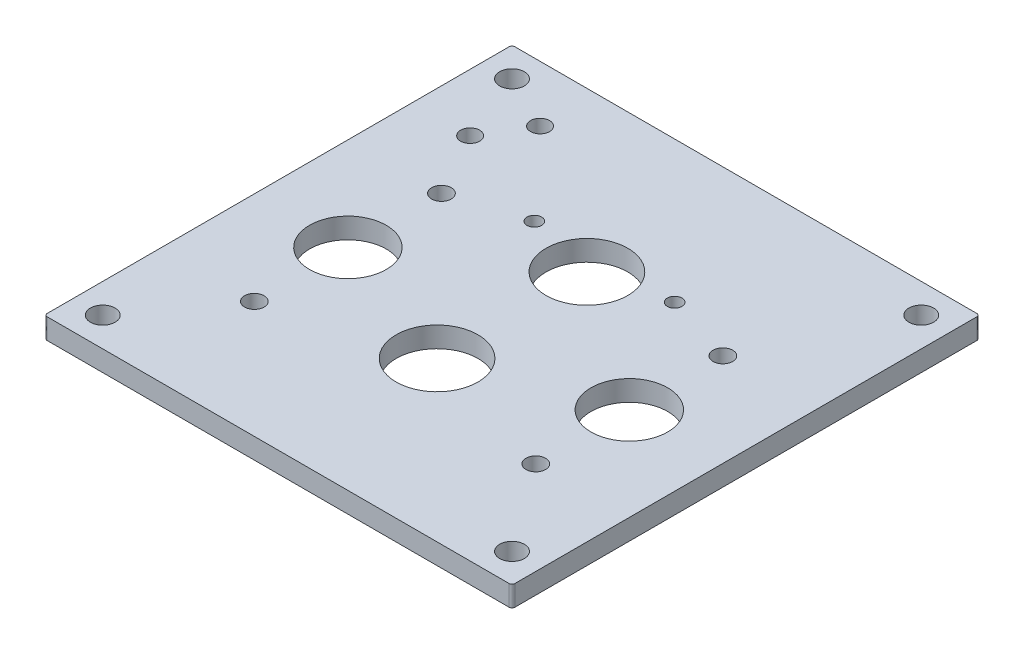
ISO-10303-21;
HEADER;
FILE_DESCRIPTION(('STEP AP214'),'2;1');
FILE_NAME('part.step','',(''),(''),'','','');
FILE_SCHEMA(('AUTOMOTIVE_DESIGN { 1 0 10303 214 1 1 1 1 }'));
ENDSEC;
DATA;
#1=APPLICATION_CONTEXT('core data for automotive mechanical design processes');
#2=APPLICATION_PROTOCOL_DEFINITION('international standard','automotive_design',2000,#1);
#3=PRODUCT_CONTEXT('',#1,'mechanical');
#4=PRODUCT('Part','Part','',(#3));
#5=PRODUCT_RELATED_PRODUCT_CATEGORY('part','',(#4));
#6=PRODUCT_DEFINITION_FORMATION('','',#4);
#7=PRODUCT_DEFINITION_CONTEXT('part definition',#1,'design');
#8=PRODUCT_DEFINITION('design','',#6,#7);
#9=PRODUCT_DEFINITION_SHAPE('','',#8);
#10=(LENGTH_UNIT() NAMED_UNIT(*) SI_UNIT(.MILLI.,.METRE.));
#11=(NAMED_UNIT(*) PLANE_ANGLE_UNIT() SI_UNIT($,.RADIAN.));
#12=(NAMED_UNIT(*) SI_UNIT($,.STERADIAN.) SOLID_ANGLE_UNIT());
#13=UNCERTAINTY_MEASURE_WITH_UNIT(LENGTH_MEASURE(1.E-05),#10,'distance_accuracy_value','');
#14=(GEOMETRIC_REPRESENTATION_CONTEXT(3) GLOBAL_UNCERTAINTY_ASSIGNED_CONTEXT((#13)) GLOBAL_UNIT_ASSIGNED_CONTEXT((#10,
#11,#12)) REPRESENTATION_CONTEXT('',''));
#15=CARTESIAN_POINT('',(0.,0.,0.));
#16=DIRECTION('',(0.,0.,1.));
#17=DIRECTION('',(1.,0.,0.));
#18=AXIS2_PLACEMENT_3D('',#15,#16,#17);
#19=CARTESIAN_POINT('',(-49.0331517632242,-5.588,-77.5164767002519));
#20=DIRECTION('',(0.,-1.,0.));
#21=DIRECTION('',(0.,0.,-1.));
#22=AXIS2_PLACEMENT_3D('',#19,#20,#21);
#23=CYLINDRICAL_SURFACE('',#22,0.79375);
#24=CARTESIAN_POINT('',(-49.0331517632242,0.,-77.5164767002519));
#25=DIRECTION('',(0.,-1.,0.));
#26=DIRECTION('',(0.,0.,-1.));
#27=AXIS2_PLACEMENT_3D('',#24,#25,#26);
#28=CIRCLE('',#27,0.79375);
#29=CARTESIAN_POINT('',(-49.0331517632242,0.,-78.3102267002519));
#30=VERTEX_POINT('',#29);
#31=CARTESIAN_POINT('',(-49.8269017632242,0.,-77.5164767002519));
#32=VERTEX_POINT('',#31);
#33=EDGE_CURVE('E101',#30,#32,#28,.F.);
#34=ORIENTED_EDGE('',*,*,#33,.F.);
#35=DIRECTION('',(0.,1.,0.));
#36=VECTOR('',#35,1.);
#37=CARTESIAN_POINT('',(-49.0331517632242,-5.588,-78.3102267002519));
#38=LINE('',#37,#36);
#39=CARTESIAN_POINT('',(-49.0331517632242,-5.588,-78.3102267002519));
#40=VERTEX_POINT('',#39);
#41=EDGE_CURVE('E116',#40,#30,#38,.T.);
#42=ORIENTED_EDGE('',*,*,#41,.F.);
#43=CARTESIAN_POINT('',(-49.0331517632242,-5.588,-77.5164767002519));
#44=DIRECTION('',(0.,-1.,0.));
#45=DIRECTION('',(0.,0.,-1.));
#46=AXIS2_PLACEMENT_3D('',#43,#44,#45);
#47=CIRCLE('',#46,0.79375);
#48=CARTESIAN_POINT('',(-49.8269017632242,-5.588,-77.5164767002519));
#49=VERTEX_POINT('',#48);
#50=EDGE_CURVE('E20',#40,#49,#47,.F.);
#51=ORIENTED_EDGE('',*,*,#50,.T.);
#52=DIRECTION('',(0.,1.,0.));
#53=VECTOR('',#52,1.);
#54=CARTESIAN_POINT('',(-49.8269017632242,-5.588,-77.5164767002519));
#55=LINE('',#54,#53);
#56=EDGE_CURVE('E111',#32,#49,#55,.F.);
#57=ORIENTED_EDGE('',*,*,#56,.F.);
#58=EDGE_LOOP('',(#34,#42,#51,#57));
#59=FACE_BOUND('',#58,.T.);
#60=ADVANCED_FACE('F17',(#59),#23,.T.);
#61=CARTESIAN_POINT('',(-49.0331517632242,-5.588,47.8960232997481));
#62=DIRECTION('',(0.,-1.,0.));
#63=DIRECTION('',(0.,0.,-1.));
#64=AXIS2_PLACEMENT_3D('',#61,#62,#63);
#65=CYLINDRICAL_SURFACE('',#64,0.79375);
#66=CARTESIAN_POINT('',(-49.0331517632242,0.,47.8960232997481));
#67=DIRECTION('',(0.,-1.,0.));
#68=DIRECTION('',(0.,0.,-1.));
#69=AXIS2_PLACEMENT_3D('',#66,#67,#68);
#70=CIRCLE('',#69,0.79375);
#71=CARTESIAN_POINT('',(-49.8269017632242,0.,47.8960232997481));
#72=VERTEX_POINT('',#71);
#73=CARTESIAN_POINT('',(-49.0331517632242,0.,48.6897732997481));
#74=VERTEX_POINT('',#73);
#75=EDGE_CURVE('E89',#72,#74,#70,.F.);
#76=ORIENTED_EDGE('',*,*,#75,.F.);
#77=DIRECTION('',(0.,1.,0.));
#78=VECTOR('',#77,1.);
#79=CARTESIAN_POINT('',(-49.8269017632242,-5.588,47.8960232997481));
#80=LINE('',#79,#78);
#81=CARTESIAN_POINT('',(-49.8269017632242,-5.588,47.8960232997481));
#82=VERTEX_POINT('',#81);
#83=EDGE_CURVE('E92',#82,#72,#80,.T.);
#84=ORIENTED_EDGE('',*,*,#83,.F.);
#85=CARTESIAN_POINT('',(-49.0331517632242,-5.588,47.8960232997481));
#86=DIRECTION('',(0.,-1.,0.));
#87=DIRECTION('',(0.,0.,-1.));
#88=AXIS2_PLACEMENT_3D('',#85,#86,#87);
#89=CIRCLE('',#88,0.79375);
#90=CARTESIAN_POINT('',(-49.0331517632242,-5.588,48.6897732997481));
#91=VERTEX_POINT('',#90);
#92=EDGE_CURVE('E229',#82,#91,#89,.F.);
#93=ORIENTED_EDGE('',*,*,#92,.T.);
#94=DIRECTION('',(0.,1.,0.));
#95=VECTOR('',#94,1.);
#96=CARTESIAN_POINT('',(-49.0331517632242,-5.588,48.6897732997481));
#97=LINE('',#96,#95);
#98=EDGE_CURVE('E95',#74,#91,#97,.F.);
#99=ORIENTED_EDGE('',*,*,#98,.F.);
#100=EDGE_LOOP('',(#76,#84,#93,#99));
#101=FACE_BOUND('',#100,.T.);
#102=ADVANCED_FACE('F91',(#101),#65,.T.);
#103=CARTESIAN_POINT('',(76.3793482367759,-5.588,47.8960232997481));
#104=DIRECTION('',(0.,-1.,0.));
#105=DIRECTION('',(0.,0.,-1.));
#106=AXIS2_PLACEMENT_3D('',#103,#104,#105);
#107=CYLINDRICAL_SURFACE('',#106,0.79375);
#108=CARTESIAN_POINT('',(76.3793482367759,0.,47.8960232997481));
#109=DIRECTION('',(0.,-1.,0.));
#110=DIRECTION('',(0.,0.,-1.));
#111=AXIS2_PLACEMENT_3D('',#108,#109,#110);
#112=CIRCLE('',#111,0.79375);
#113=CARTESIAN_POINT('',(76.3793482367759,0.,48.6897732997481));
#114=VERTEX_POINT('',#113);
#115=CARTESIAN_POINT('',(77.1730982367758,0.,47.8960232997481));
#116=VERTEX_POINT('',#115);
#117=EDGE_CURVE('E226',#114,#116,#112,.F.);
#118=ORIENTED_EDGE('',*,*,#117,.F.);
#119=DIRECTION('',(0.,1.,0.));
#120=VECTOR('',#119,1.);
#121=CARTESIAN_POINT('',(76.3793482367759,-5.588,48.6897732997481));
#122=LINE('',#121,#120);
#123=CARTESIAN_POINT('',(76.3793482367759,-5.588,48.6897732997481));
#124=VERTEX_POINT('',#123);
#125=EDGE_CURVE('E110',#124,#114,#122,.T.);
#126=ORIENTED_EDGE('',*,*,#125,.F.);
#127=CARTESIAN_POINT('',(76.3793482367759,-5.588,47.8960232997481));
#128=DIRECTION('',(0.,-1.,0.));
#129=DIRECTION('',(0.,0.,-1.));
#130=AXIS2_PLACEMENT_3D('',#127,#128,#129);
#131=CIRCLE('',#130,0.79375);
#132=CARTESIAN_POINT('',(77.1730982367758,-5.588,47.8960232997481));
#133=VERTEX_POINT('',#132);
#134=EDGE_CURVE('E35',#124,#133,#131,.F.);
#135=ORIENTED_EDGE('',*,*,#134,.T.);
#136=DIRECTION('',(0.,1.,0.));
#137=VECTOR('',#136,1.);
#138=CARTESIAN_POINT('',(77.1730982367758,-5.588,47.8960232997481));
#139=LINE('',#138,#137);
#140=EDGE_CURVE('E242',#116,#133,#139,.F.);
#141=ORIENTED_EDGE('',*,*,#140,.F.);
#142=EDGE_LOOP('',(#118,#126,#135,#141));
#143=FACE_BOUND('',#142,.T.);
#144=ADVANCED_FACE('F256',(#143),#107,.T.);
#145=CARTESIAN_POINT('',(76.3793482367759,-5.588,-77.5164767002519));
#146=DIRECTION('',(0.,-1.,0.));
#147=DIRECTION('',(0.,0.,-1.));
#148=AXIS2_PLACEMENT_3D('',#145,#146,#147);
#149=CYLINDRICAL_SURFACE('',#148,0.79375);
#150=CARTESIAN_POINT('',(76.3793482367759,0.,-77.5164767002519));
#151=DIRECTION('',(0.,-1.,0.));
#152=DIRECTION('',(0.,0.,-1.));
#153=AXIS2_PLACEMENT_3D('',#150,#151,#152);
#154=CIRCLE('',#153,0.79375);
#155=CARTESIAN_POINT('',(77.1730982367758,0.,-77.5164767002519));
#156=VERTEX_POINT('',#155);
#157=CARTESIAN_POINT('',(76.3793482367759,0.,-78.3102267002519));
#158=VERTEX_POINT('',#157);
#159=EDGE_CURVE('E224',#156,#158,#154,.F.);
#160=ORIENTED_EDGE('',*,*,#159,.F.);
#161=DIRECTION('',(0.,1.,0.));
#162=VECTOR('',#161,1.);
#163=CARTESIAN_POINT('',(77.1730982367758,-5.588,-77.5164767002519));
#164=LINE('',#163,#162);
#165=CARTESIAN_POINT('',(77.1730982367758,-5.588,-77.5164767002519));
#166=VERTEX_POINT('',#165);
#167=EDGE_CURVE('E200',#166,#156,#164,.T.);
#168=ORIENTED_EDGE('',*,*,#167,.F.);
#169=CARTESIAN_POINT('',(76.3793482367759,-5.588,-77.5164767002519));
#170=DIRECTION('',(0.,-1.,0.));
#171=DIRECTION('',(0.,0.,-1.));
#172=AXIS2_PLACEMENT_3D('',#169,#170,#171);
#173=CIRCLE('',#172,0.79375);
#174=CARTESIAN_POINT('',(76.3793482367759,-5.588,-78.3102267002519));
#175=VERTEX_POINT('',#174);
#176=EDGE_CURVE('E59',#166,#175,#173,.F.);
#177=ORIENTED_EDGE('',*,*,#176,.T.);
#178=DIRECTION('',(0.,1.,0.));
#179=VECTOR('',#178,1.);
#180=CARTESIAN_POINT('',(76.3793482367759,-5.588,-78.3102267002519));
#181=LINE('',#180,#179);
#182=EDGE_CURVE('E120',#158,#175,#181,.F.);
#183=ORIENTED_EDGE('',*,*,#182,.F.);
#184=EDGE_LOOP('',(#160,#168,#177,#183));
#185=FACE_BOUND('',#184,.T.);
#186=ADVANCED_FACE('F259',(#185),#149,.T.);
#187=CARTESIAN_POINT('',(-49.8269017632242,0.,48.6897732997481));
#188=DIRECTION('',(0.,1.,0.));
#189=DIRECTION('',(0.,0.,1.));
#190=AXIS2_PLACEMENT_3D('',#187,#188,#189);
#191=PLANE('',#190);
#192=CARTESIAN_POINT('',(51.8813432040601,0.,-8.4602267002519));
#193=DIRECTION('',(0.,1.,0.));
#194=DIRECTION('',(0.,0.,1.));
#195=AXIS2_PLACEMENT_3D('',#192,#193,#194);
#196=CIRCLE('',#195,10.414);
#197=CARTESIAN_POINT('',(51.8813432040601,0.,1.9537732997481));
#198=VERTEX_POINT('',#197);
#199=EDGE_CURVE('E176',#198,#198,#196,.F.);
#200=ORIENTED_EDGE('',*,*,#199,.T.);
#201=EDGE_LOOP('',(#200));
#202=FACE_BOUND('',#201,.T.);
#203=CARTESIAN_POINT('',(-24.5351467305084,0.,-33.8602267002519));
#204=DIRECTION('',(0.,1.,0.));
#205=DIRECTION('',(0.,0.,1.));
#206=AXIS2_PLACEMENT_3D('',#203,#204,#205);
#207=CIRCLE('',#206,2.667);
#208=CARTESIAN_POINT('',(-24.5351467305084,0.,-31.1932267002519));
#209=VERTEX_POINT('',#208);
#210=EDGE_CURVE('E179',#209,#209,#207,.F.);
#211=ORIENTED_EDGE('',*,*,#210,.T.);
#212=EDGE_LOOP('',(#211));
#213=FACE_BOUND('',#212,.T.);
#214=CARTESIAN_POINT('',(-24.5351467305084,0.,16.9397732997481));
#215=DIRECTION('',(0.,1.,0.));
#216=DIRECTION('',(0.,0.,1.));
#217=AXIS2_PLACEMENT_3D('',#214,#215,#216);
#218=CIRCLE('',#217,2.667);
#219=CARTESIAN_POINT('',(-24.5351467305084,0.,19.6067732997481));
#220=VERTEX_POINT('',#219);
#221=EDGE_CURVE('E182',#220,#220,#218,.F.);
#222=ORIENTED_EDGE('',*,*,#221,.T.);
#223=EDGE_LOOP('',(#222));
#224=FACE_BOUND('',#223,.T.);
#225=CARTESIAN_POINT('',(-24.5351467305084,0.,-8.4602267002519));
#226=DIRECTION('',(0.,1.,0.));
#227=DIRECTION('',(0.,0.,1.));
#228=AXIS2_PLACEMENT_3D('',#225,#226,#227);
#229=CIRCLE('',#228,10.414);
#230=CARTESIAN_POINT('',(-24.5351467305084,0.,1.9537732997481));
#231=VERTEX_POINT('',#230);
#232=EDGE_CURVE('E185',#231,#231,#229,.F.);
#233=ORIENTED_EDGE('',*,*,#232,.T.);
#234=EDGE_LOOP('',(#233));
#235=FACE_BOUND('',#234,.T.);
#236=CARTESIAN_POINT('',(51.8813432040601,0.,16.9397732997481));
#237=DIRECTION('',(0.,1.,0.));
#238=DIRECTION('',(0.,0.,1.));
#239=AXIS2_PLACEMENT_3D('',#236,#237,#238);
#240=CIRCLE('',#239,2.667);
#241=CARTESIAN_POINT('',(51.8813432040601,0.,19.6067732997481));
#242=VERTEX_POINT('',#241);
#243=EDGE_CURVE('E188',#242,#242,#240,.F.);
#244=ORIENTED_EDGE('',*,*,#243,.T.);
#245=EDGE_LOOP('',(#244));
#246=FACE_BOUND('',#245,.T.);
#247=CARTESIAN_POINT('',(13.6730982367758,0.,-35.1556267002519));
#248=DIRECTION('',(0.,1.,0.));
#249=DIRECTION('',(0.,0.,1.));
#250=AXIS2_PLACEMENT_3D('',#247,#248,#249);
#251=CIRCLE('',#250,11.1125);
#252=CARTESIAN_POINT('',(13.6730982367758,0.,-24.0431267002519));
#253=VERTEX_POINT('',#252);
#254=EDGE_CURVE('E191',#253,#253,#251,.F.);
#255=ORIENTED_EDGE('',*,*,#254,.T.);
#256=EDGE_LOOP('',(#255));
#257=FACE_BOUND('',#256,.T.);
#258=CARTESIAN_POINT('',(-41.8894017632242,0.,-70.3727267002519));
#259=DIRECTION('',(0.,1.,0.));
#260=DIRECTION('',(0.,0.,1.));
#261=AXIS2_PLACEMENT_3D('',#258,#259,#260);
#262=CIRCLE('',#261,3.3528);
#263=CARTESIAN_POINT('',(-41.8894017632242,0.,-67.0199267002519));
#264=VERTEX_POINT('',#263);
#265=EDGE_CURVE('E194',#264,#264,#262,.F.);
#266=ORIENTED_EDGE('',*,*,#265,.T.);
#267=EDGE_LOOP('',(#266));
#268=FACE_BOUND('',#267,.T.);
#269=CARTESIAN_POINT('',(69.2355982367758,0.,40.7522732997481));
#270=DIRECTION('',(0.,1.,0.));
#271=DIRECTION('',(0.,0.,1.));
#272=AXIS2_PLACEMENT_3D('',#269,#270,#271);
#273=CIRCLE('',#272,3.3528);
#274=CARTESIAN_POINT('',(69.2355982367758,0.,44.1050732997481));
#275=VERTEX_POINT('',#274);
#276=EDGE_CURVE('E197',#275,#275,#273,.F.);
#277=ORIENTED_EDGE('',*,*,#276,.T.);
#278=EDGE_LOOP('',(#277));
#279=FACE_BOUND('',#278,.T.);
#280=DIRECTION('',(0.,0.,1.));
#281=VECTOR('',#280,1.);
#282=CARTESIAN_POINT('',(-49.8269017632242,0.,-78.3102267002519));
#283=LINE('',#282,#281);
#284=EDGE_CURVE('E107',#72,#32,#283,.F.);
#285=ORIENTED_EDGE('',*,*,#284,.F.);
#286=ORIENTED_EDGE('',*,*,#75,.T.);
#287=DIRECTION('',(1.,0.,0.));
#288=VECTOR('',#287,1.);
#289=CARTESIAN_POINT('',(-49.8269017632242,0.,48.6897732997481));
#290=LINE('',#289,#288);
#291=EDGE_CURVE('E124',#114,#74,#290,.F.);
#292=ORIENTED_EDGE('',*,*,#291,.F.);
#293=ORIENTED_EDGE('',*,*,#117,.T.);
#294=DIRECTION('',(0.,0.,-1.));
#295=VECTOR('',#294,1.);
#296=CARTESIAN_POINT('',(77.1730982367758,0.,48.6897732997481));
#297=LINE('',#296,#295);
#298=EDGE_CURVE('E244',#156,#116,#297,.F.);
#299=ORIENTED_EDGE('',*,*,#298,.F.);
#300=ORIENTED_EDGE('',*,*,#159,.T.);
#301=DIRECTION('',(-1.,0.,0.));
#302=VECTOR('',#301,1.);
#303=CARTESIAN_POINT('',(77.1730982367758,0.,-78.3102267002519));
#304=LINE('',#303,#302);
#305=EDGE_CURVE('E126',#30,#158,#304,.F.);
#306=ORIENTED_EDGE('',*,*,#305,.F.);
#307=ORIENTED_EDGE('',*,*,#33,.T.);
#308=EDGE_LOOP('',(#285,#286,#292,#293,#299,#300,#306,#307));
#309=FACE_BOUND('',#308,.T.);
#310=CARTESIAN_POINT('',(69.2355982367759,0.,-70.3727267002519));
#311=DIRECTION('',(0.,1.,0.));
#312=DIRECTION('',(0.,0.,1.));
#313=AXIS2_PLACEMENT_3D('',#310,#311,#312);
#314=CIRCLE('',#313,3.3528);
#315=CARTESIAN_POINT('',(69.2355982367759,0.,-67.0199267002519));
#316=VERTEX_POINT('',#315);
#317=EDGE_CURVE('E128',#316,#316,#314,.F.);
#318=ORIENTED_EDGE('',*,*,#317,.T.);
#319=EDGE_LOOP('',(#318));
#320=FACE_BOUND('',#319,.T.);
#321=CARTESIAN_POINT('',(13.6730982367758,0.,5.53517329974811));
#322=DIRECTION('',(0.,1.,0.));
#323=DIRECTION('',(0.,0.,1.));
#324=AXIS2_PLACEMENT_3D('',#321,#322,#323);
#325=CIRCLE('',#324,11.1125);
#326=CARTESIAN_POINT('',(13.6730982367758,0.,16.6476732997481));
#327=VERTEX_POINT('',#326);
#328=EDGE_CURVE('E203',#327,#327,#325,.F.);
#329=ORIENTED_EDGE('',*,*,#328,.T.);
#330=EDGE_LOOP('',(#329));
#331=FACE_BOUND('',#330,.T.);
#332=CARTESIAN_POINT('',(-41.8894017632242,0.,40.7522732997481));
#333=DIRECTION('',(0.,1.,0.));
#334=DIRECTION('',(0.,0.,1.));
#335=AXIS2_PLACEMENT_3D('',#332,#333,#334);
#336=CIRCLE('',#335,3.3528);
#337=CARTESIAN_POINT('',(-41.8894017632242,0.,44.1050732997481));
#338=VERTEX_POINT('',#337);
#339=EDGE_CURVE('E206',#338,#338,#336,.F.);
#340=ORIENTED_EDGE('',*,*,#339,.T.);
#341=EDGE_LOOP('',(#340));
#342=FACE_BOUND('',#341,.T.);
#343=CARTESIAN_POINT('',(51.8813432040601,0.,-33.8602267002519));
#344=DIRECTION('',(0.,1.,0.));
#345=DIRECTION('',(0.,0.,1.));
#346=AXIS2_PLACEMENT_3D('',#343,#344,#345);
#347=CIRCLE('',#346,2.667);
#348=CARTESIAN_POINT('',(51.8813432040601,0.,-31.1932267002519));
#349=VERTEX_POINT('',#348);
#350=EDGE_CURVE('E209',#349,#349,#347,.F.);
#351=ORIENTED_EDGE('',*,*,#350,.T.);
#352=EDGE_LOOP('',(#351));
#353=FACE_BOUND('',#352,.T.);
#354=CARTESIAN_POINT('',(32.7230982367758,0.,-39.9181267002519));
#355=DIRECTION('',(0.,-1.,0.));
#356=DIRECTION('',(0.,0.,-1.));
#357=AXIS2_PLACEMENT_3D('',#354,#355,#356);
#358=CIRCLE('',#357,1.98374);
#359=CARTESIAN_POINT('',(32.7230982367758,0.,-41.9018667002519));
#360=VERTEX_POINT('',#359);
#361=EDGE_CURVE('E212',#360,#360,#358,.T.);
#362=ORIENTED_EDGE('',*,*,#361,.T.);
#363=EDGE_LOOP('',(#362));
#364=FACE_BOUND('',#363,.T.);
#365=CARTESIAN_POINT('',(-5.37690176322416,0.,-39.9181267002519));
#366=DIRECTION('',(0.,-1.,0.));
#367=DIRECTION('',(0.,0.,-1.));
#368=AXIS2_PLACEMENT_3D('',#365,#366,#367);
#369=CIRCLE('',#368,1.98374);
#370=CARTESIAN_POINT('',(-5.37690176322416,0.,-41.9018667002519));
#371=VERTEX_POINT('',#370);
#372=EDGE_CURVE('E215',#371,#371,#369,.T.);
#373=ORIENTED_EDGE('',*,*,#372,.T.);
#374=EDGE_LOOP('',(#373));
#375=FACE_BOUND('',#374,.T.);
#376=CARTESIAN_POINT('',(-26.9669017632242,0.,-63.0702267002519));
#377=DIRECTION('',(0.,1.,0.));
#378=DIRECTION('',(0.,0.,1.));
#379=AXIS2_PLACEMENT_3D('',#376,#377,#378);
#380=CIRCLE('',#379,2.5908);
#381=CARTESIAN_POINT('',(-26.9669017632242,0.,-60.4794267002519));
#382=VERTEX_POINT('',#381);
#383=EDGE_CURVE('E218',#382,#382,#380,.F.);
#384=ORIENTED_EDGE('',*,*,#383,.T.);
#385=EDGE_LOOP('',(#384));
#386=FACE_BOUND('',#385,.T.);
#387=CARTESIAN_POINT('',(-34.2059017632242,0.,-51.3227267002519));
#388=DIRECTION('',(0.,1.,0.));
#389=DIRECTION('',(0.,0.,1.));
#390=AXIS2_PLACEMENT_3D('',#387,#388,#389);
#391=CIRCLE('',#390,2.5908);
#392=CARTESIAN_POINT('',(-34.2059017632242,0.,-48.7319267002519));
#393=VERTEX_POINT('',#392);
#394=EDGE_CURVE('E100',#393,#393,#391,.F.);
#395=ORIENTED_EDGE('',*,*,#394,.T.);
#396=EDGE_LOOP('',(#395));
#397=FACE_BOUND('',#396,.T.);
#398=ADVANCED_FACE('F113',(#202,#213,#224,#235,#246,#257,#268,#279,#309,#320,#331,#342,#353,
#364,#375,#386,#397),#191,.T.);
#399=CARTESIAN_POINT('',(-34.2059017632242,-5.588,-51.3227267002519));
#400=DIRECTION('',(0.,1.,0.));
#401=DIRECTION('',(0.,0.,1.));
#402=AXIS2_PLACEMENT_3D('',#399,#400,#401);
#403=CYLINDRICAL_SURFACE('',#402,2.5908);
#404=CARTESIAN_POINT('',(-34.2059017632242,-5.588,-51.3227267002519));
#405=DIRECTION('',(0.,1.,0.));
#406=DIRECTION('',(0.,0.,1.));
#407=AXIS2_PLACEMENT_3D('',#404,#405,#406);
#408=CIRCLE('',#407,2.5908);
#409=CARTESIAN_POINT('',(-34.2059017632242,-5.588,-48.7319267002519));
#410=VERTEX_POINT('',#409);
#411=EDGE_CURVE('E173',#410,#410,#408,.F.);
#412=ORIENTED_EDGE('',*,*,#411,.T.);
#413=EDGE_LOOP('',(#412));
#414=FACE_BOUND('',#413,.T.);
#415=ORIENTED_EDGE('',*,*,#394,.F.);
#416=EDGE_LOOP('',(#415));
#417=FACE_BOUND('',#416,.T.);
#418=ADVANCED_FACE('F419',(#414,#417),#403,.F.);
#419=CARTESIAN_POINT('',(-26.9669017632242,-5.588,-63.0702267002519));
#420=DIRECTION('',(0.,1.,0.));
#421=DIRECTION('',(0.,0.,1.));
#422=AXIS2_PLACEMENT_3D('',#419,#420,#421);
#423=CYLINDRICAL_SURFACE('',#422,2.5908);
#424=CARTESIAN_POINT('',(-26.9669017632242,-5.588,-63.0702267002519));
#425=DIRECTION('',(0.,1.,0.));
#426=DIRECTION('',(0.,0.,1.));
#427=AXIS2_PLACEMENT_3D('',#424,#425,#426);
#428=CIRCLE('',#427,2.5908);
#429=CARTESIAN_POINT('',(-26.9669017632242,-5.588,-60.4794267002519));
#430=VERTEX_POINT('',#429);
#431=EDGE_CURVE('E170',#430,#430,#428,.F.);
#432=ORIENTED_EDGE('',*,*,#431,.T.);
#433=EDGE_LOOP('',(#432));
#434=FACE_BOUND('',#433,.T.);
#435=ORIENTED_EDGE('',*,*,#383,.F.);
#436=EDGE_LOOP('',(#435));
#437=FACE_BOUND('',#436,.T.);
#438=ADVANCED_FACE('F411',(#434,#437),#423,.F.);
#439=CARTESIAN_POINT('',(-5.37690176322416,-5.588,-39.9181267002519));
#440=DIRECTION('',(0.,-1.,0.));
#441=DIRECTION('',(0.,0.,-1.));
#442=AXIS2_PLACEMENT_3D('',#439,#440,#441);
#443=CYLINDRICAL_SURFACE('',#442,1.98374);
#444=CARTESIAN_POINT('',(-5.37690176322416,-5.588,-39.9181267002519));
#445=DIRECTION('',(0.,-1.,0.));
#446=DIRECTION('',(0.,0.,-1.));
#447=AXIS2_PLACEMENT_3D('',#444,#445,#446);
#448=CIRCLE('',#447,1.98374);
#449=CARTESIAN_POINT('',(-5.37690176322416,-5.588,-41.9018667002519));
#450=VERTEX_POINT('',#449);
#451=EDGE_CURVE('E167',#450,#450,#448,.T.);
#452=ORIENTED_EDGE('',*,*,#451,.T.);
#453=EDGE_LOOP('',(#452));
#454=FACE_BOUND('',#453,.T.);
#455=ORIENTED_EDGE('',*,*,#372,.F.);
#456=EDGE_LOOP('',(#455));
#457=FACE_BOUND('',#456,.T.);
#458=ADVANCED_FACE('F403',(#454,#457),#443,.F.);
#459=CARTESIAN_POINT('',(32.7230982367758,-5.588,-39.9181267002519));
#460=DIRECTION('',(0.,-1.,0.));
#461=DIRECTION('',(0.,0.,-1.));
#462=AXIS2_PLACEMENT_3D('',#459,#460,#461);
#463=CYLINDRICAL_SURFACE('',#462,1.98374);
#464=CARTESIAN_POINT('',(32.7230982367758,-5.588,-39.9181267002519));
#465=DIRECTION('',(0.,-1.,0.));
#466=DIRECTION('',(0.,0.,-1.));
#467=AXIS2_PLACEMENT_3D('',#464,#465,#466);
#468=CIRCLE('',#467,1.98374);
#469=CARTESIAN_POINT('',(32.7230982367758,-5.588,-41.9018667002519));
#470=VERTEX_POINT('',#469);
#471=EDGE_CURVE('E164',#470,#470,#468,.T.);
#472=ORIENTED_EDGE('',*,*,#471,.T.);
#473=EDGE_LOOP('',(#472));
#474=FACE_BOUND('',#473,.T.);
#475=ORIENTED_EDGE('',*,*,#361,.F.);
#476=EDGE_LOOP('',(#475));
#477=FACE_BOUND('',#476,.T.);
#478=ADVANCED_FACE('F395',(#474,#477),#463,.F.);
#479=CARTESIAN_POINT('',(51.8813432040601,174.104030274022,-33.8602267002519));
#480=DIRECTION('',(0.,1.,0.));
#481=DIRECTION('',(0.,0.,1.));
#482=AXIS2_PLACEMENT_3D('',#479,#480,#481);
#483=CYLINDRICAL_SURFACE('',#482,2.667);
#484=ORIENTED_EDGE('',*,*,#350,.F.);
#485=EDGE_LOOP('',(#484));
#486=FACE_BOUND('',#485,.T.);
#487=CARTESIAN_POINT('',(51.8813432040601,-5.58800000000001,-33.8602267002519));
#488=DIRECTION('',(0.,1.,0.));
#489=DIRECTION('',(0.,0.,1.));
#490=AXIS2_PLACEMENT_3D('',#487,#488,#489);
#491=CIRCLE('',#490,2.667);
#492=CARTESIAN_POINT('',(51.8813432040601,-5.58800000000001,-31.1932267002519));
#493=VERTEX_POINT('',#492);
#494=EDGE_CURVE('E161',#493,#493,#491,.F.);
#495=ORIENTED_EDGE('',*,*,#494,.T.);
#496=EDGE_LOOP('',(#495));
#497=FACE_BOUND('',#496,.T.);
#498=ADVANCED_FACE('F387',(#486,#497),#483,.F.);
#499=CARTESIAN_POINT('',(-41.8894017632242,174.104030274022,40.7522732997481));
#500=DIRECTION('',(0.,1.,0.));
#501=DIRECTION('',(0.,0.,1.));
#502=AXIS2_PLACEMENT_3D('',#499,#500,#501);
#503=CYLINDRICAL_SURFACE('',#502,3.3528);
#504=ORIENTED_EDGE('',*,*,#339,.F.);
#505=EDGE_LOOP('',(#504));
#506=FACE_BOUND('',#505,.T.);
#507=CARTESIAN_POINT('',(-41.8894017632242,-5.58800000000001,40.7522732997481));
#508=DIRECTION('',(0.,1.,0.));
#509=DIRECTION('',(0.,0.,1.));
#510=AXIS2_PLACEMENT_3D('',#507,#508,#509);
#511=CIRCLE('',#510,3.3528);
#512=CARTESIAN_POINT('',(-41.8894017632242,-5.58800000000001,44.1050732997481));
#513=VERTEX_POINT('',#512);
#514=EDGE_CURVE('E158',#513,#513,#511,.F.);
#515=ORIENTED_EDGE('',*,*,#514,.T.);
#516=EDGE_LOOP('',(#515));
#517=FACE_BOUND('',#516,.T.);
#518=ADVANCED_FACE('F379',(#506,#517),#503,.F.);
#519=CARTESIAN_POINT('',(13.6730982367758,174.104030274022,5.53517329974811));
#520=DIRECTION('',(0.,1.,0.));
#521=DIRECTION('',(0.,0.,1.));
#522=AXIS2_PLACEMENT_3D('',#519,#520,#521);
#523=CYLINDRICAL_SURFACE('',#522,11.1125);
#524=ORIENTED_EDGE('',*,*,#328,.F.);
#525=EDGE_LOOP('',(#524));
#526=FACE_BOUND('',#525,.T.);
#527=CARTESIAN_POINT('',(13.6730982367758,-5.58800000000001,5.53517329974811));
#528=DIRECTION('',(0.,1.,0.));
#529=DIRECTION('',(0.,0.,1.));
#530=AXIS2_PLACEMENT_3D('',#527,#528,#529);
#531=CIRCLE('',#530,11.1125);
#532=CARTESIAN_POINT('',(13.6730982367758,-5.58800000000001,16.6476732997481));
#533=VERTEX_POINT('',#532);
#534=EDGE_CURVE('E155',#533,#533,#531,.F.);
#535=ORIENTED_EDGE('',*,*,#534,.T.);
#536=EDGE_LOOP('',(#535));
#537=FACE_BOUND('',#536,.T.);
#538=ADVANCED_FACE('F271',(#526,#537),#523,.F.);
#539=CARTESIAN_POINT('',(69.2355982367759,174.104030274022,-70.3727267002519));
#540=DIRECTION('',(0.,1.,0.));
#541=DIRECTION('',(0.,0.,1.));
#542=AXIS2_PLACEMENT_3D('',#539,#540,#541);
#543=CYLINDRICAL_SURFACE('',#542,3.3528);
#544=ORIENTED_EDGE('',*,*,#317,.F.);
#545=EDGE_LOOP('',(#544));
#546=FACE_BOUND('',#545,.T.);
#547=CARTESIAN_POINT('',(69.2355982367759,-5.58800000000001,-70.3727267002519));
#548=DIRECTION('',(0.,1.,0.));
#549=DIRECTION('',(0.,0.,1.));
#550=AXIS2_PLACEMENT_3D('',#547,#548,#549);
#551=CIRCLE('',#550,3.3528);
#552=CARTESIAN_POINT('',(69.2355982367759,-5.58800000000001,-67.0199267002519));
#553=VERTEX_POINT('',#552);
#554=EDGE_CURVE('E151',#553,#553,#551,.F.);
#555=ORIENTED_EDGE('',*,*,#554,.T.);
#556=EDGE_LOOP('',(#555));
#557=FACE_BOUND('',#556,.T.);
#558=ADVANCED_FACE('F263',(#546,#557),#543,.F.);
#559=CARTESIAN_POINT('',(77.1730982367758,-5.588,-78.3102267002519));
#560=DIRECTION('',(0.,0.,-1.));
#561=DIRECTION('',(-1.,0.,0.));
#562=AXIS2_PLACEMENT_3D('',#559,#560,#561);
#563=PLANE('',#562);
#564=DIRECTION('',(1.,0.,0.));
#565=VECTOR('',#564,1.);
#566=CARTESIAN_POINT('',(-49.8269017632242,-5.588,-78.3102267002519));
#567=LINE('',#566,#565);
#568=EDGE_CURVE('E154',#175,#40,#567,.F.);
#569=ORIENTED_EDGE('',*,*,#568,.T.);
#570=ORIENTED_EDGE('',*,*,#41,.T.);
#571=ORIENTED_EDGE('',*,*,#305,.T.);
#572=ORIENTED_EDGE('',*,*,#182,.T.);
#573=EDGE_LOOP('',(#569,#570,#571,#572));
#574=FACE_BOUND('',#573,.T.);
#575=ADVANCED_FACE('F261',(#574),#563,.T.);
#576=CARTESIAN_POINT('',(-49.8269017632242,-5.588,-78.3102267002519));
#577=DIRECTION('',(-1.,0.,0.));
#578=DIRECTION('',(0.,0.,1.));
#579=AXIS2_PLACEMENT_3D('',#576,#577,#578);
#580=PLANE('',#579);
#581=DIRECTION('',(0.,0.,1.));
#582=VECTOR('',#581,1.);
#583=CARTESIAN_POINT('',(-49.8269017632242,-5.588,48.6897732997481));
#584=LINE('',#583,#582);
#585=EDGE_CURVE('E109',#49,#82,#584,.T.);
#586=ORIENTED_EDGE('',*,*,#585,.T.);
#587=ORIENTED_EDGE('',*,*,#83,.T.);
#588=ORIENTED_EDGE('',*,*,#284,.T.);
#589=ORIENTED_EDGE('',*,*,#56,.T.);
#590=EDGE_LOOP('',(#586,#587,#588,#589));
#591=FACE_BOUND('',#590,.T.);
#592=ADVANCED_FACE('F105',(#591),#580,.T.);
#593=CARTESIAN_POINT('',(-49.8269017632242,-5.588,48.6897732997481));
#594=DIRECTION('',(0.,0.,1.));
#595=DIRECTION('',(1.,0.,0.));
#596=AXIS2_PLACEMENT_3D('',#593,#594,#595);
#597=PLANE('',#596);
#598=ORIENTED_EDGE('',*,*,#291,.T.);
#599=ORIENTED_EDGE('',*,*,#98,.T.);
#600=DIRECTION('',(1.,0.,0.));
#601=VECTOR('',#600,1.);
#602=CARTESIAN_POINT('',(-49.8269017632242,-5.588,48.6897732997481));
#603=LINE('',#602,#601);
#604=EDGE_CURVE('E235',#91,#124,#603,.T.);
#605=ORIENTED_EDGE('',*,*,#604,.T.);
#606=ORIENTED_EDGE('',*,*,#125,.T.);
#607=EDGE_LOOP('',(#598,#599,#605,#606));
#608=FACE_BOUND('',#607,.T.);
#609=ADVANCED_FACE('F258',(#608),#597,.T.);
#610=CARTESIAN_POINT('',(77.1730982367758,-5.588,48.6897732997481));
#611=DIRECTION('',(1.,0.,0.));
#612=DIRECTION('',(0.,0.,-1.));
#613=AXIS2_PLACEMENT_3D('',#610,#611,#612);
#614=PLANE('',#613);
#615=DIRECTION('',(0.,0.,1.));
#616=VECTOR('',#615,1.);
#617=CARTESIAN_POINT('',(77.1730982367758,-5.588,48.6897732997481));
#618=LINE('',#617,#616);
#619=EDGE_CURVE('E150',#133,#166,#618,.F.);
#620=ORIENTED_EDGE('',*,*,#619,.T.);
#621=ORIENTED_EDGE('',*,*,#167,.T.);
#622=ORIENTED_EDGE('',*,*,#298,.T.);
#623=ORIENTED_EDGE('',*,*,#140,.T.);
#624=EDGE_LOOP('',(#620,#621,#622,#623));
#625=FACE_BOUND('',#624,.T.);
#626=ADVANCED_FACE('F253',(#625),#614,.T.);
#627=CARTESIAN_POINT('',(69.2355982367758,174.104030274022,40.7522732997481));
#628=DIRECTION('',(0.,1.,0.));
#629=DIRECTION('',(0.,0.,1.));
#630=AXIS2_PLACEMENT_3D('',#627,#628,#629);
#631=CYLINDRICAL_SURFACE('',#630,3.3528);
#632=ORIENTED_EDGE('',*,*,#276,.F.);
#633=EDGE_LOOP('',(#632));
#634=FACE_BOUND('',#633,.T.);
#635=CARTESIAN_POINT('',(69.2355982367758,-5.58800000000001,40.7522732997481));
#636=DIRECTION('',(0.,1.,0.));
#637=DIRECTION('',(0.,0.,1.));
#638=AXIS2_PLACEMENT_3D('',#635,#636,#637);
#639=CIRCLE('',#638,3.3528);
#640=CARTESIAN_POINT('',(69.2355982367758,-5.58800000000001,44.1050732997481));
#641=VERTEX_POINT('',#640);
#642=EDGE_CURVE('E147',#641,#641,#639,.F.);
#643=ORIENTED_EDGE('',*,*,#642,.T.);
#644=EDGE_LOOP('',(#643));
#645=FACE_BOUND('',#644,.T.);
#646=ADVANCED_FACE('F309',(#634,#645),#631,.F.);
#647=CARTESIAN_POINT('',(-41.8894017632242,174.104030274022,-70.3727267002519));
#648=DIRECTION('',(0.,1.,0.));
#649=DIRECTION('',(0.,0.,1.));
#650=AXIS2_PLACEMENT_3D('',#647,#648,#649);
#651=CYLINDRICAL_SURFACE('',#650,3.3528);
#652=ORIENTED_EDGE('',*,*,#265,.F.);
#653=EDGE_LOOP('',(#652));
#654=FACE_BOUND('',#653,.T.);
#655=CARTESIAN_POINT('',(-41.8894017632242,-5.58800000000001,-70.3727267002519));
#656=DIRECTION('',(0.,1.,0.));
#657=DIRECTION('',(0.,0.,1.));
#658=AXIS2_PLACEMENT_3D('',#655,#656,#657);
#659=CIRCLE('',#658,3.3528);
#660=CARTESIAN_POINT('',(-41.8894017632242,-5.58800000000001,-67.0199267002519));
#661=VERTEX_POINT('',#660);
#662=EDGE_CURVE('E144',#661,#661,#659,.F.);
#663=ORIENTED_EDGE('',*,*,#662,.T.);
#664=EDGE_LOOP('',(#663));
#665=FACE_BOUND('',#664,.T.);
#666=ADVANCED_FACE('F305',(#654,#665),#651,.F.);
#667=CARTESIAN_POINT('',(13.6730982367758,174.104030274022,-35.1556267002519));
#668=DIRECTION('',(0.,1.,0.));
#669=DIRECTION('',(0.,0.,1.));
#670=AXIS2_PLACEMENT_3D('',#667,#668,#669);
#671=CYLINDRICAL_SURFACE('',#670,11.1125);
#672=ORIENTED_EDGE('',*,*,#254,.F.);
#673=EDGE_LOOP('',(#672));
#674=FACE_BOUND('',#673,.T.);
#675=CARTESIAN_POINT('',(13.6730982367758,-5.58800000000001,-35.1556267002519));
#676=DIRECTION('',(0.,1.,0.));
#677=DIRECTION('',(0.,0.,1.));
#678=AXIS2_PLACEMENT_3D('',#675,#676,#677);
#679=CIRCLE('',#678,11.1125);
#680=CARTESIAN_POINT('',(13.6730982367758,-5.58800000000001,-24.0431267002519));
#681=VERTEX_POINT('',#680);
#682=EDGE_CURVE('E141',#681,#681,#679,.F.);
#683=ORIENTED_EDGE('',*,*,#682,.T.);
#684=EDGE_LOOP('',(#683));
#685=FACE_BOUND('',#684,.T.);
#686=ADVANCED_FACE('F301',(#674,#685),#671,.F.);
#687=CARTESIAN_POINT('',(51.8813432040601,174.104030274022,16.9397732997481));
#688=DIRECTION('',(0.,1.,0.));
#689=DIRECTION('',(0.,0.,1.));
#690=AXIS2_PLACEMENT_3D('',#687,#688,#689);
#691=CYLINDRICAL_SURFACE('',#690,2.667);
#692=ORIENTED_EDGE('',*,*,#243,.F.);
#693=EDGE_LOOP('',(#692));
#694=FACE_BOUND('',#693,.T.);
#695=CARTESIAN_POINT('',(51.8813432040601,-5.58800000000001,16.9397732997481));
#696=DIRECTION('',(0.,1.,0.));
#697=DIRECTION('',(0.,0.,1.));
#698=AXIS2_PLACEMENT_3D('',#695,#696,#697);
#699=CIRCLE('',#698,2.667);
#700=CARTESIAN_POINT('',(51.8813432040601,-5.58800000000001,19.6067732997481));
#701=VERTEX_POINT('',#700);
#702=EDGE_CURVE('E138',#701,#701,#699,.F.);
#703=ORIENTED_EDGE('',*,*,#702,.T.);
#704=EDGE_LOOP('',(#703));
#705=FACE_BOUND('',#704,.T.);
#706=ADVANCED_FACE('F297',(#694,#705),#691,.F.);
#707=CARTESIAN_POINT('',(-24.5351467305084,174.104030274022,-8.4602267002519));
#708=DIRECTION('',(0.,1.,0.));
#709=DIRECTION('',(0.,0.,1.));
#710=AXIS2_PLACEMENT_3D('',#707,#708,#709);
#711=CYLINDRICAL_SURFACE('',#710,10.414);
#712=ORIENTED_EDGE('',*,*,#232,.F.);
#713=EDGE_LOOP('',(#712));
#714=FACE_BOUND('',#713,.T.);
#715=CARTESIAN_POINT('',(-24.5351467305084,-5.58800000000001,-8.4602267002519));
#716=DIRECTION('',(0.,1.,0.));
#717=DIRECTION('',(0.,0.,1.));
#718=AXIS2_PLACEMENT_3D('',#715,#716,#717);
#719=CIRCLE('',#718,10.414);
#720=CARTESIAN_POINT('',(-24.5351467305084,-5.58800000000001,1.9537732997481));
#721=VERTEX_POINT('',#720);
#722=EDGE_CURVE('E135',#721,#721,#719,.F.);
#723=ORIENTED_EDGE('',*,*,#722,.T.);
#724=EDGE_LOOP('',(#723));
#725=FACE_BOUND('',#724,.T.);
#726=ADVANCED_FACE('F293',(#714,#725),#711,.F.);
#727=CARTESIAN_POINT('',(-24.5351467305084,174.104030274022,16.9397732997481));
#728=DIRECTION('',(0.,1.,0.));
#729=DIRECTION('',(0.,0.,1.));
#730=AXIS2_PLACEMENT_3D('',#727,#728,#729);
#731=CYLINDRICAL_SURFACE('',#730,2.667);
#732=ORIENTED_EDGE('',*,*,#221,.F.);
#733=EDGE_LOOP('',(#732));
#734=FACE_BOUND('',#733,.T.);
#735=CARTESIAN_POINT('',(-24.5351467305084,-5.58800000000001,16.9397732997481));
#736=DIRECTION('',(0.,1.,0.));
#737=DIRECTION('',(0.,0.,1.));
#738=AXIS2_PLACEMENT_3D('',#735,#736,#737);
#739=CIRCLE('',#738,2.667);
#740=CARTESIAN_POINT('',(-24.5351467305084,-5.58800000000001,19.6067732997481));
#741=VERTEX_POINT('',#740);
#742=EDGE_CURVE('E132',#741,#741,#739,.F.);
#743=ORIENTED_EDGE('',*,*,#742,.T.);
#744=EDGE_LOOP('',(#743));
#745=FACE_BOUND('',#744,.T.);
#746=ADVANCED_FACE('F289',(#734,#745),#731,.F.);
#747=CARTESIAN_POINT('',(-24.5351467305084,174.104030274022,-33.8602267002519));
#748=DIRECTION('',(0.,1.,0.));
#749=DIRECTION('',(0.,0.,1.));
#750=AXIS2_PLACEMENT_3D('',#747,#748,#749);
#751=CYLINDRICAL_SURFACE('',#750,2.667);
#752=ORIENTED_EDGE('',*,*,#210,.F.);
#753=EDGE_LOOP('',(#752));
#754=FACE_BOUND('',#753,.T.);
#755=CARTESIAN_POINT('',(-24.5351467305084,-5.58800000000001,-33.8602267002519));
#756=DIRECTION('',(0.,1.,0.));
#757=DIRECTION('',(0.,0.,1.));
#758=AXIS2_PLACEMENT_3D('',#755,#756,#757);
#759=CIRCLE('',#758,2.667);
#760=CARTESIAN_POINT('',(-24.5351467305084,-5.58800000000001,-31.1932267002519));
#761=VERTEX_POINT('',#760);
#762=EDGE_CURVE('E26',#761,#761,#759,.F.);
#763=ORIENTED_EDGE('',*,*,#762,.T.);
#764=EDGE_LOOP('',(#763));
#765=FACE_BOUND('',#764,.T.);
#766=ADVANCED_FACE('F281',(#754,#765),#751,.F.);
#767=CARTESIAN_POINT('',(51.8813432040601,174.104030274022,-8.4602267002519));
#768=DIRECTION('',(0.,1.,0.));
#769=DIRECTION('',(0.,0.,1.));
#770=AXIS2_PLACEMENT_3D('',#767,#768,#769);
#771=CYLINDRICAL_SURFACE('',#770,10.414);
#772=ORIENTED_EDGE('',*,*,#199,.F.);
#773=EDGE_LOOP('',(#772));
#774=FACE_BOUND('',#773,.T.);
#775=CARTESIAN_POINT('',(51.8813432040601,-5.58800000000001,-8.4602267002519));
#776=DIRECTION('',(0.,1.,0.));
#777=DIRECTION('',(0.,0.,1.));
#778=AXIS2_PLACEMENT_3D('',#775,#776,#777);
#779=CIRCLE('',#778,10.414);
#780=CARTESIAN_POINT('',(51.8813432040601,-5.58800000000001,1.9537732997481));
#781=VERTEX_POINT('',#780);
#782=EDGE_CURVE('E11',#781,#781,#779,.F.);
#783=ORIENTED_EDGE('',*,*,#782,.T.);
#784=EDGE_LOOP('',(#783));
#785=FACE_BOUND('',#784,.T.);
#786=ADVANCED_FACE('F275',(#774,#785),#771,.F.);
#787=CARTESIAN_POINT('',(-49.8269017632242,-5.588,48.6897732997481));
#788=DIRECTION('',(0.,1.,0.));
#789=DIRECTION('',(0.,0.,1.));
#790=AXIS2_PLACEMENT_3D('',#787,#788,#789);
#791=PLANE('',#790);
#792=ORIENTED_EDGE('',*,*,#782,.F.);
#793=EDGE_LOOP('',(#792));
#794=FACE_BOUND('',#793,.T.);
#795=ORIENTED_EDGE('',*,*,#762,.F.);
#796=EDGE_LOOP('',(#795));
#797=FACE_BOUND('',#796,.T.);
#798=ORIENTED_EDGE('',*,*,#742,.F.);
#799=EDGE_LOOP('',(#798));
#800=FACE_BOUND('',#799,.T.);
#801=ORIENTED_EDGE('',*,*,#722,.F.);
#802=EDGE_LOOP('',(#801));
#803=FACE_BOUND('',#802,.T.);
#804=ORIENTED_EDGE('',*,*,#702,.F.);
#805=EDGE_LOOP('',(#804));
#806=FACE_BOUND('',#805,.T.);
#807=ORIENTED_EDGE('',*,*,#682,.F.);
#808=EDGE_LOOP('',(#807));
#809=FACE_BOUND('',#808,.T.);
#810=ORIENTED_EDGE('',*,*,#662,.F.);
#811=EDGE_LOOP('',(#810));
#812=FACE_BOUND('',#811,.T.);
#813=ORIENTED_EDGE('',*,*,#642,.F.);
#814=EDGE_LOOP('',(#813));
#815=FACE_BOUND('',#814,.T.);
#816=ORIENTED_EDGE('',*,*,#134,.F.);
#817=ORIENTED_EDGE('',*,*,#604,.F.);
#818=ORIENTED_EDGE('',*,*,#92,.F.);
#819=ORIENTED_EDGE('',*,*,#585,.F.);
#820=ORIENTED_EDGE('',*,*,#50,.F.);
#821=ORIENTED_EDGE('',*,*,#568,.F.);
#822=ORIENTED_EDGE('',*,*,#176,.F.);
#823=ORIENTED_EDGE('',*,*,#619,.F.);
#824=EDGE_LOOP('',(#816,#817,#818,#819,#820,#821,#822,#823));
#825=FACE_BOUND('',#824,.T.);
#826=ORIENTED_EDGE('',*,*,#554,.F.);
#827=EDGE_LOOP('',(#826));
#828=FACE_BOUND('',#827,.T.);
#829=ORIENTED_EDGE('',*,*,#534,.F.);
#830=EDGE_LOOP('',(#829));
#831=FACE_BOUND('',#830,.T.);
#832=ORIENTED_EDGE('',*,*,#514,.F.);
#833=EDGE_LOOP('',(#832));
#834=FACE_BOUND('',#833,.T.);
#835=ORIENTED_EDGE('',*,*,#494,.F.);
#836=EDGE_LOOP('',(#835));
#837=FACE_BOUND('',#836,.T.);
#838=ORIENTED_EDGE('',*,*,#471,.F.);
#839=EDGE_LOOP('',(#838));
#840=FACE_BOUND('',#839,.T.);
#841=ORIENTED_EDGE('',*,*,#451,.F.);
#842=EDGE_LOOP('',(#841));
#843=FACE_BOUND('',#842,.T.);
#844=ORIENTED_EDGE('',*,*,#431,.F.);
#845=EDGE_LOOP('',(#844));
#846=FACE_BOUND('',#845,.T.);
#847=ORIENTED_EDGE('',*,*,#411,.F.);
#848=EDGE_LOOP('',(#847));
#849=FACE_BOUND('',#848,.T.);
#850=ADVANCED_FACE('F232',(#794,#797,#800,#803,#806,#809,#812,#815,#825,#828,#831,#834,#837,
#840,#843,#846,#849),#791,.F.);
#851=CLOSED_SHELL('',(#60,#102,#144,#186,#398,#418,#438,#458,#478,#498,#518,#538,#558,#575,#592,
#609,#626,#646,#666,#686,#706,#726,#746,#766,#786,#850));
#852=MANIFOLD_SOLID_BREP('B1',#851);
#853=ADVANCED_BREP_SHAPE_REPRESENTATION('',(#18,#852),#14);
#854=SHAPE_DEFINITION_REPRESENTATION(#9,#853);
ENDSEC;
END-ISO-10303-21;
